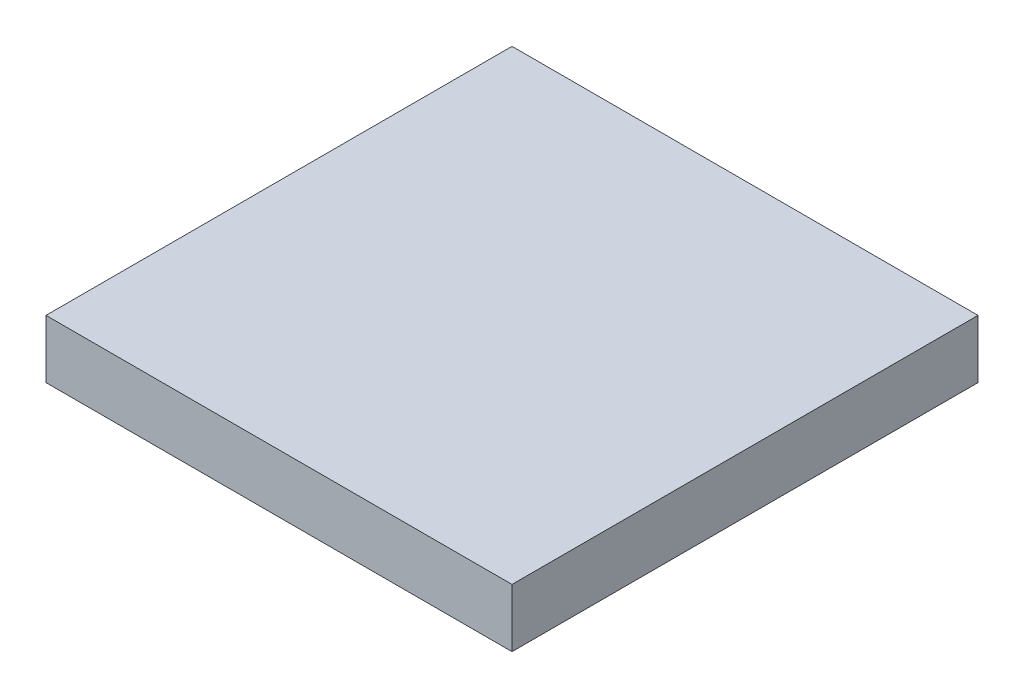
ISO-10303-21;
HEADER;
FILE_DESCRIPTION(('STEP AP214'),'2;1');
FILE_NAME('part.step','',(''),(''),'','','');
FILE_SCHEMA(('AUTOMOTIVE_DESIGN { 1 0 10303 214 1 1 1 1 }'));
ENDSEC;
DATA;
#1=APPLICATION_CONTEXT('core data for automotive mechanical design processes');
#2=APPLICATION_PROTOCOL_DEFINITION('international standard','automotive_design',2000,#1);
#3=PRODUCT_CONTEXT('',#1,'mechanical');
#4=PRODUCT('Part','Part','',(#3));
#5=PRODUCT_RELATED_PRODUCT_CATEGORY('part','',(#4));
#6=PRODUCT_DEFINITION_FORMATION('','',#4);
#7=PRODUCT_DEFINITION_CONTEXT('part definition',#1,'design');
#8=PRODUCT_DEFINITION('design','',#6,#7);
#9=PRODUCT_DEFINITION_SHAPE('','',#8);
#10=(LENGTH_UNIT() NAMED_UNIT(*) SI_UNIT(.MILLI.,.METRE.));
#11=(NAMED_UNIT(*) PLANE_ANGLE_UNIT() SI_UNIT($,.RADIAN.));
#12=(NAMED_UNIT(*) SI_UNIT($,.STERADIAN.) SOLID_ANGLE_UNIT());
#13=UNCERTAINTY_MEASURE_WITH_UNIT(LENGTH_MEASURE(1.E-05),#10,'distance_accuracy_value','');
#14=(GEOMETRIC_REPRESENTATION_CONTEXT(3) GLOBAL_UNCERTAINTY_ASSIGNED_CONTEXT((#13)) GLOBAL_UNIT_ASSIGNED_CONTEXT((#10,
#11,#12)) REPRESENTATION_CONTEXT('',''));
#15=CARTESIAN_POINT('',(0.,0.,0.));
#16=DIRECTION('',(0.,0.,1.));
#17=DIRECTION('',(1.,0.,0.));
#18=AXIS2_PLACEMENT_3D('',#15,#16,#17);
#19=CARTESIAN_POINT('',(0.,3.175,0.));
#20=DIRECTION('',(1.,0.,0.));
#21=DIRECTION('',(0.,0.,-1.));
#22=AXIS2_PLACEMENT_3D('',#19,#20,#21);
#23=PLANE('',#22);
#24=DIRECTION('',(0.,0.,1.));
#25=VECTOR('',#24,1.);
#26=CARTESIAN_POINT('',(0.,0.,0.));
#27=LINE('',#26,#25);
#28=CARTESIAN_POINT('',(0.,0.,-25.4));
#29=VERTEX_POINT('',#28);
#30=CARTESIAN_POINT('',(0.,0.,0.));
#31=VERTEX_POINT('',#30);
#32=EDGE_CURVE('E105',#29,#31,#27,.T.);
#33=ORIENTED_EDGE('',*,*,#32,.T.);
#34=DIRECTION('',(0.,-1.,0.));
#35=VECTOR('',#34,1.);
#36=CARTESIAN_POINT('',(0.,3.175,0.));
#37=LINE('',#36,#35);
#38=CARTESIAN_POINT('',(0.,3.175,0.));
#39=VERTEX_POINT('',#38);
#40=EDGE_CURVE('E11',#39,#31,#37,.T.);
#41=ORIENTED_EDGE('',*,*,#40,.F.);
#42=DIRECTION('',(0.,0.,1.));
#43=VECTOR('',#42,1.);
#44=CARTESIAN_POINT('',(0.,3.175,0.));
#45=LINE('',#44,#43);
#46=CARTESIAN_POINT('',(0.,3.175,-25.4));
#47=VERTEX_POINT('',#46);
#48=EDGE_CURVE('E89',#47,#39,#45,.T.);
#49=ORIENTED_EDGE('',*,*,#48,.F.);
#50=DIRECTION('',(0.,-1.,0.));
#51=VECTOR('',#50,1.);
#52=CARTESIAN_POINT('',(0.,3.175,-25.4));
#53=LINE('',#52,#51);
#54=EDGE_CURVE('E97',#47,#29,#53,.T.);
#55=ORIENTED_EDGE('',*,*,#54,.T.);
#56=EDGE_LOOP('',(#33,#41,#49,#55));
#57=FACE_BOUND('',#56,.T.);
#58=ADVANCED_FACE('F39',(#57),#23,.F.);
#59=CARTESIAN_POINT('',(0.,3.175,0.));
#60=DIRECTION('',(0.,0.,-1.));
#61=DIRECTION('',(-1.,0.,0.));
#62=AXIS2_PLACEMENT_3D('',#59,#60,#61);
#63=PLANE('',#62);
#64=DIRECTION('',(1.,0.,0.));
#65=VECTOR('',#64,1.);
#66=CARTESIAN_POINT('',(0.,0.,0.));
#67=LINE('',#66,#65);
#68=CARTESIAN_POINT('',(25.4,0.,0.));
#69=VERTEX_POINT('',#68);
#70=EDGE_CURVE('E92',#31,#69,#67,.T.);
#71=ORIENTED_EDGE('',*,*,#70,.T.);
#72=DIRECTION('',(0.,-1.,0.));
#73=VECTOR('',#72,1.);
#74=CARTESIAN_POINT('',(25.4,3.175,0.));
#75=LINE('',#74,#73);
#76=CARTESIAN_POINT('',(25.4,3.175,0.));
#77=VERTEX_POINT('',#76);
#78=EDGE_CURVE('E50',#77,#69,#75,.T.);
#79=ORIENTED_EDGE('',*,*,#78,.F.);
#80=DIRECTION('',(1.,0.,0.));
#81=VECTOR('',#80,1.);
#82=CARTESIAN_POINT('',(0.,3.175,0.));
#83=LINE('',#82,#81);
#84=EDGE_CURVE('E82',#39,#77,#83,.T.);
#85=ORIENTED_EDGE('',*,*,#84,.F.);
#86=ORIENTED_EDGE('',*,*,#40,.T.);
#87=EDGE_LOOP('',(#71,#79,#85,#86));
#88=FACE_BOUND('',#87,.T.);
#89=ADVANCED_FACE('F93',(#88),#63,.F.);
#90=CARTESIAN_POINT('',(25.4,3.175,0.));
#91=DIRECTION('',(-1.,0.,0.));
#92=DIRECTION('',(0.,0.,1.));
#93=AXIS2_PLACEMENT_3D('',#90,#91,#92);
#94=PLANE('',#93);
#95=DIRECTION('',(0.,0.,-1.));
#96=VECTOR('',#95,1.);
#97=CARTESIAN_POINT('',(25.4,0.,0.));
#98=LINE('',#97,#96);
#99=CARTESIAN_POINT('',(25.4,0.,-25.4));
#100=VERTEX_POINT('',#99);
#101=EDGE_CURVE('E72',#69,#100,#98,.T.);
#102=ORIENTED_EDGE('',*,*,#101,.T.);
#103=DIRECTION('',(0.,-1.,0.));
#104=VECTOR('',#103,1.);
#105=CARTESIAN_POINT('',(25.4,3.175,-25.4));
#106=LINE('',#105,#104);
#107=CARTESIAN_POINT('',(25.4,3.175,-25.4));
#108=VERTEX_POINT('',#107);
#109=EDGE_CURVE('E94',#108,#100,#106,.T.);
#110=ORIENTED_EDGE('',*,*,#109,.F.);
#111=DIRECTION('',(0.,0.,-1.));
#112=VECTOR('',#111,1.);
#113=CARTESIAN_POINT('',(25.4,3.175,0.));
#114=LINE('',#113,#112);
#115=EDGE_CURVE('E88',#77,#108,#114,.T.);
#116=ORIENTED_EDGE('',*,*,#115,.F.);
#117=ORIENTED_EDGE('',*,*,#78,.T.);
#118=EDGE_LOOP('',(#102,#110,#116,#117));
#119=FACE_BOUND('',#118,.T.);
#120=ADVANCED_FACE('F96',(#119),#94,.F.);
#121=CARTESIAN_POINT('',(0.,3.175,-25.4));
#122=DIRECTION('',(0.,0.,1.));
#123=DIRECTION('',(1.,0.,0.));
#124=AXIS2_PLACEMENT_3D('',#121,#122,#123);
#125=PLANE('',#124);
#126=DIRECTION('',(-1.,0.,0.));
#127=VECTOR('',#126,1.);
#128=CARTESIAN_POINT('',(0.,0.,-25.4));
#129=LINE('',#128,#127);
#130=EDGE_CURVE('E76',#100,#29,#129,.T.);
#131=ORIENTED_EDGE('',*,*,#130,.T.);
#132=ORIENTED_EDGE('',*,*,#54,.F.);
#133=DIRECTION('',(-1.,0.,0.));
#134=VECTOR('',#133,1.);
#135=CARTESIAN_POINT('',(0.,3.175,-25.4));
#136=LINE('',#135,#134);
#137=EDGE_CURVE('E54',#108,#47,#136,.T.);
#138=ORIENTED_EDGE('',*,*,#137,.F.);
#139=ORIENTED_EDGE('',*,*,#109,.T.);
#140=EDGE_LOOP('',(#131,#132,#138,#139));
#141=FACE_BOUND('',#140,.T.);
#142=ADVANCED_FACE('F108',(#141),#125,.F.);
#143=CARTESIAN_POINT('',(0.,3.175,0.));
#144=DIRECTION('',(0.,-1.,0.));
#145=DIRECTION('',(0.,0.,-1.));
#146=AXIS2_PLACEMENT_3D('',#143,#144,#145);
#147=PLANE('',#146);
#148=ORIENTED_EDGE('',*,*,#48,.T.);
#149=ORIENTED_EDGE('',*,*,#84,.T.);
#150=ORIENTED_EDGE('',*,*,#115,.T.);
#151=ORIENTED_EDGE('',*,*,#137,.T.);
#152=EDGE_LOOP('',(#148,#149,#150,#151));
#153=FACE_BOUND('',#152,.T.);
#154=ADVANCED_FACE('F86',(#153),#147,.F.);
#155=CARTESIAN_POINT('',(0.,0.,0.));
#156=DIRECTION('',(0.,-1.,0.));
#157=DIRECTION('',(0.,0.,-1.));
#158=AXIS2_PLACEMENT_3D('',#155,#156,#157);
#159=PLANE('',#158);
#160=ORIENTED_EDGE('',*,*,#32,.F.);
#161=ORIENTED_EDGE('',*,*,#130,.F.);
#162=ORIENTED_EDGE('',*,*,#101,.F.);
#163=ORIENTED_EDGE('',*,*,#70,.F.);
#164=EDGE_LOOP('',(#160,#161,#162,#163));
#165=FACE_BOUND('',#164,.T.);
#166=ADVANCED_FACE('F115',(#165),#159,.T.);
#167=CLOSED_SHELL('',(#58,#89,#120,#142,#154,#166));
#168=MANIFOLD_SOLID_BREP('B2',#167);
#169=ADVANCED_BREP_SHAPE_REPRESENTATION('',(#18,#168),#14);
#170=SHAPE_DEFINITION_REPRESENTATION(#9,#169);
ENDSEC;
END-ISO-10303-21;
